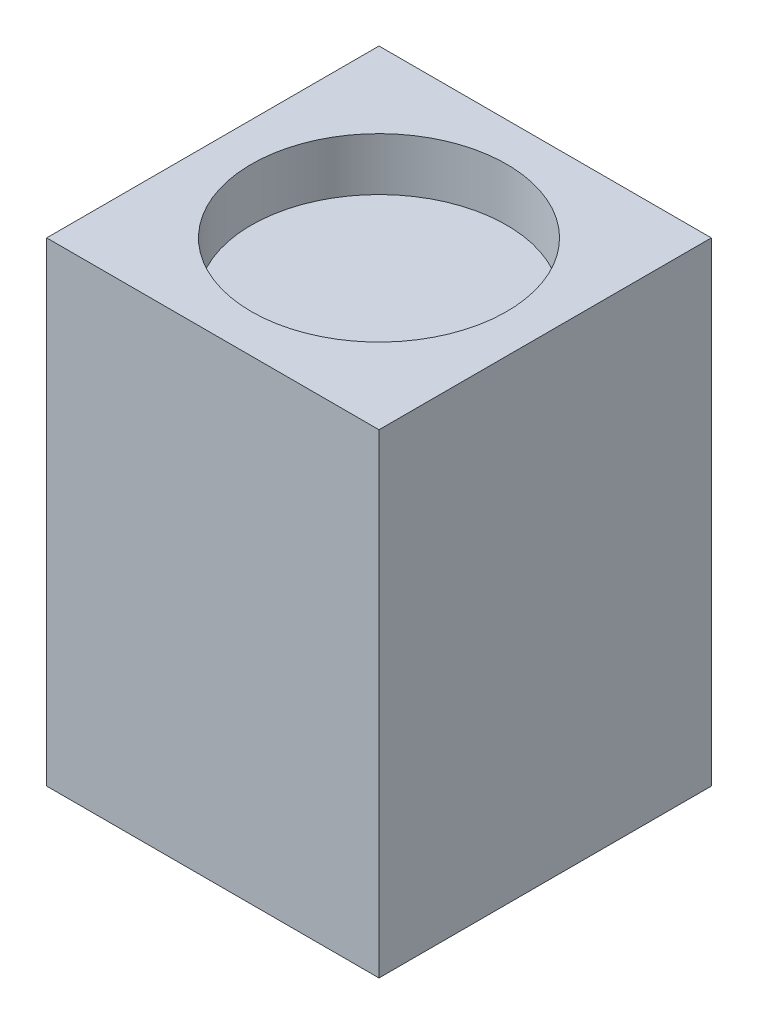
ISO-10303-21;
HEADER;
FILE_DESCRIPTION(('STEP AP214'),'2;1');
FILE_NAME('part.step','',(''),(''),'','','');
FILE_SCHEMA(('AUTOMOTIVE_DESIGN { 1 0 10303 214 1 1 1 1 }'));
ENDSEC;
DATA;
#1=APPLICATION_CONTEXT('core data for automotive mechanical design processes');
#2=APPLICATION_PROTOCOL_DEFINITION('international standard','automotive_design',2000,#1);
#3=PRODUCT_CONTEXT('',#1,'mechanical');
#4=PRODUCT('Part','Part','',(#3));
#5=PRODUCT_RELATED_PRODUCT_CATEGORY('part','',(#4));
#6=PRODUCT_DEFINITION_FORMATION('','',#4);
#7=PRODUCT_DEFINITION_CONTEXT('part definition',#1,'design');
#8=PRODUCT_DEFINITION('design','',#6,#7);
#9=PRODUCT_DEFINITION_SHAPE('','',#8);
#10=(LENGTH_UNIT() NAMED_UNIT(*) SI_UNIT(.MILLI.,.METRE.));
#11=(NAMED_UNIT(*) PLANE_ANGLE_UNIT() SI_UNIT($,.RADIAN.));
#12=(NAMED_UNIT(*) SI_UNIT($,.STERADIAN.) SOLID_ANGLE_UNIT());
#13=UNCERTAINTY_MEASURE_WITH_UNIT(LENGTH_MEASURE(1.E-05),#10,'distance_accuracy_value','');
#14=(GEOMETRIC_REPRESENTATION_CONTEXT(3) GLOBAL_UNCERTAINTY_ASSIGNED_CONTEXT((#13)) GLOBAL_UNIT_ASSIGNED_CONTEXT((#10,
#11,#12)) REPRESENTATION_CONTEXT('',''));
#15=CARTESIAN_POINT('',(0.,0.,0.));
#16=DIRECTION('',(0.,0.,1.));
#17=DIRECTION('',(1.,0.,0.));
#18=AXIS2_PLACEMENT_3D('',#15,#16,#17);
#19=CARTESIAN_POINT('',(-80.,228.6,0.));
#20=DIRECTION('',(1.,0.,0.));
#21=DIRECTION('',(0.,0.,-1.));
#22=AXIS2_PLACEMENT_3D('',#19,#20,#21);
#23=PLANE('',#22);
#24=DIRECTION('',(0.,0.,1.));
#25=VECTOR('',#24,1.);
#26=CARTESIAN_POINT('',(-80.,0.,0.));
#27=LINE('',#26,#25);
#28=CARTESIAN_POINT('',(-80.,0.,-80.));
#29=VERTEX_POINT('',#28);
#30=CARTESIAN_POINT('',(-80.,0.,80.));
#31=VERTEX_POINT('',#30);
#32=EDGE_CURVE('E81',#29,#31,#27,.T.);
#33=ORIENTED_EDGE('',*,*,#32,.T.);
#34=DIRECTION('',(0.,-1.,0.));
#35=VECTOR('',#34,1.);
#36=CARTESIAN_POINT('',(-80.,228.6,80.));
#37=LINE('',#36,#35);
#38=CARTESIAN_POINT('',(-80.,228.6,80.));
#39=VERTEX_POINT('',#38);
#40=EDGE_CURVE('E11',#39,#31,#37,.T.);
#41=ORIENTED_EDGE('',*,*,#40,.F.);
#42=DIRECTION('',(0.,0.,1.));
#43=VECTOR('',#42,1.);
#44=CARTESIAN_POINT('',(-80.,228.6,-80.));
#45=LINE('',#44,#43);
#46=CARTESIAN_POINT('',(-80.,228.6,-80.));
#47=VERTEX_POINT('',#46);
#48=EDGE_CURVE('E85',#47,#39,#45,.T.);
#49=ORIENTED_EDGE('',*,*,#48,.F.);
#50=DIRECTION('',(0.,-1.,0.));
#51=VECTOR('',#50,1.);
#52=CARTESIAN_POINT('',(-80.,228.6,-80.));
#53=LINE('',#52,#51);
#54=EDGE_CURVE('E109',#47,#29,#53,.T.);
#55=ORIENTED_EDGE('',*,*,#54,.T.);
#56=EDGE_LOOP('',(#33,#41,#49,#55));
#57=FACE_BOUND('',#56,.T.);
#58=ADVANCED_FACE('F44',(#57),#23,.F.);
#59=CARTESIAN_POINT('',(80.,228.6,80.));
#60=DIRECTION('',(0.,0.,1.));
#61=DIRECTION('',(1.,0.,0.));
#62=AXIS2_PLACEMENT_3D('',#59,#60,#61);
#63=PLANE('',#62);
#64=DIRECTION('',(-1.,0.,0.));
#65=VECTOR('',#64,1.);
#66=CARTESIAN_POINT('',(80.,0.,80.));
#67=LINE('',#66,#65);
#68=CARTESIAN_POINT('',(80.,0.,80.));
#69=VERTEX_POINT('',#68);
#70=EDGE_CURVE('E100',#69,#31,#67,.T.);
#71=ORIENTED_EDGE('',*,*,#70,.F.);
#72=DIRECTION('',(0.,-1.,0.));
#73=VECTOR('',#72,1.);
#74=CARTESIAN_POINT('',(80.,228.6,80.));
#75=LINE('',#74,#73);
#76=CARTESIAN_POINT('',(80.,228.6,80.));
#77=VERTEX_POINT('',#76);
#78=EDGE_CURVE('E53',#77,#69,#75,.T.);
#79=ORIENTED_EDGE('',*,*,#78,.F.);
#80=DIRECTION('',(1.,0.,0.));
#81=VECTOR('',#80,1.);
#82=CARTESIAN_POINT('',(-80.,228.6,80.));
#83=LINE('',#82,#81);
#84=EDGE_CURVE('E88',#39,#77,#83,.T.);
#85=ORIENTED_EDGE('',*,*,#84,.F.);
#86=ORIENTED_EDGE('',*,*,#40,.T.);
#87=EDGE_LOOP('',(#71,#79,#85,#86));
#88=FACE_BOUND('',#87,.T.);
#89=ADVANCED_FACE('F99',(#88),#63,.T.);
#90=CARTESIAN_POINT('',(80.,228.6,0.));
#91=DIRECTION('',(-1.,0.,0.));
#92=DIRECTION('',(0.,0.,1.));
#93=AXIS2_PLACEMENT_3D('',#90,#91,#92);
#94=PLANE('',#93);
#95=DIRECTION('',(0.,0.,-1.));
#96=VECTOR('',#95,1.);
#97=CARTESIAN_POINT('',(80.,0.,0.));
#98=LINE('',#97,#96);
#99=CARTESIAN_POINT('',(80.,0.,-80.));
#100=VERTEX_POINT('',#99);
#101=EDGE_CURVE('E118',#69,#100,#98,.T.);
#102=ORIENTED_EDGE('',*,*,#101,.T.);
#103=DIRECTION('',(0.,-1.,0.));
#104=VECTOR('',#103,1.);
#105=CARTESIAN_POINT('',(80.,228.6,-80.));
#106=LINE('',#105,#104);
#107=CARTESIAN_POINT('',(80.,228.6,-80.));
#108=VERTEX_POINT('',#107);
#109=EDGE_CURVE('E103',#108,#100,#106,.T.);
#110=ORIENTED_EDGE('',*,*,#109,.F.);
#111=DIRECTION('',(0.,0.,1.));
#112=VECTOR('',#111,1.);
#113=CARTESIAN_POINT('',(80.,228.6,0.));
#114=LINE('',#113,#112);
#115=EDGE_CURVE('E92',#108,#77,#114,.T.);
#116=ORIENTED_EDGE('',*,*,#115,.T.);
#117=ORIENTED_EDGE('',*,*,#78,.T.);
#118=EDGE_LOOP('',(#102,#110,#116,#117));
#119=FACE_BOUND('',#118,.T.);
#120=ADVANCED_FACE('F104',(#119),#94,.F.);
#121=CARTESIAN_POINT('',(0.,228.6,-80.));
#122=DIRECTION('',(0.,0.,1.));
#123=DIRECTION('',(1.,0.,0.));
#124=AXIS2_PLACEMENT_3D('',#121,#122,#123);
#125=PLANE('',#124);
#126=DIRECTION('',(-1.,0.,0.));
#127=VECTOR('',#126,1.);
#128=CARTESIAN_POINT('',(0.,0.,-80.));
#129=LINE('',#128,#127);
#130=EDGE_CURVE('E77',#100,#29,#129,.T.);
#131=ORIENTED_EDGE('',*,*,#130,.T.);
#132=ORIENTED_EDGE('',*,*,#54,.F.);
#133=DIRECTION('',(-1.,0.,0.));
#134=VECTOR('',#133,1.);
#135=CARTESIAN_POINT('',(80.,228.6,-80.));
#136=LINE('',#135,#134);
#137=EDGE_CURVE('E61',#108,#47,#136,.T.);
#138=ORIENTED_EDGE('',*,*,#137,.F.);
#139=ORIENTED_EDGE('',*,*,#109,.T.);
#140=EDGE_LOOP('',(#131,#132,#138,#139));
#141=FACE_BOUND('',#140,.T.);
#142=ADVANCED_FACE('F128',(#141),#125,.F.);
#143=CARTESIAN_POINT('',(0.,228.6,0.));
#144=DIRECTION('',(0.,1.,0.));
#145=DIRECTION('',(0.,0.,1.));
#146=AXIS2_PLACEMENT_3D('',#143,#144,#145);
#147=PLANE('',#146);
#148=CARTESIAN_POINT('',(0.,228.6,0.));
#149=DIRECTION('',(0.,1.,0.));
#150=DIRECTION('',(0.,0.,1.));
#151=AXIS2_PLACEMENT_3D('',#148,#149,#150);
#152=CIRCLE('',#151,61.468);
#153=CARTESIAN_POINT('',(0.,228.6,61.468));
#154=VERTEX_POINT('',#153);
#155=EDGE_CURVE('E132',#154,#154,#152,.T.);
#156=ORIENTED_EDGE('',*,*,#155,.F.);
#157=EDGE_LOOP('',(#156));
#158=FACE_BOUND('',#157,.T.);
#159=ORIENTED_EDGE('',*,*,#48,.T.);
#160=ORIENTED_EDGE('',*,*,#84,.T.);
#161=ORIENTED_EDGE('',*,*,#115,.F.);
#162=ORIENTED_EDGE('',*,*,#137,.T.);
#163=EDGE_LOOP('',(#159,#160,#161,#162));
#164=FACE_BOUND('',#163,.T.);
#165=ADVANCED_FACE('F90',(#158,#164),#147,.T.);
#166=CARTESIAN_POINT('',(0.,0.,0.));
#167=DIRECTION('',(0.,1.,0.));
#168=DIRECTION('',(0.,0.,1.));
#169=AXIS2_PLACEMENT_3D('',#166,#167,#168);
#170=PLANE('',#169);
#171=ORIENTED_EDGE('',*,*,#32,.F.);
#172=ORIENTED_EDGE('',*,*,#130,.F.);
#173=ORIENTED_EDGE('',*,*,#101,.F.);
#174=ORIENTED_EDGE('',*,*,#70,.T.);
#175=EDGE_LOOP('',(#171,#172,#173,#174));
#176=FACE_BOUND('',#175,.T.);
#177=ADVANCED_FACE('F145',(#176),#170,.F.);
#178=CARTESIAN_POINT('',(0.,203.2,0.));
#179=DIRECTION('',(0.,1.,0.));
#180=DIRECTION('',(0.,0.,1.));
#181=AXIS2_PLACEMENT_3D('',#178,#179,#180);
#182=CYLINDRICAL_SURFACE('',#181,61.468);
#183=CARTESIAN_POINT('',(0.,203.2,0.));
#184=DIRECTION('',(0.,1.,0.));
#185=DIRECTION('',(0.,0.,1.));
#186=AXIS2_PLACEMENT_3D('',#183,#184,#185);
#187=CIRCLE('',#186,61.468);
#188=CARTESIAN_POINT('',(0.,203.2,61.468));
#189=VERTEX_POINT('',#188);
#190=EDGE_CURVE('E115',#189,#189,#187,.T.);
#191=ORIENTED_EDGE('',*,*,#190,.F.);
#192=EDGE_LOOP('',(#191));
#193=FACE_BOUND('',#192,.T.);
#194=ORIENTED_EDGE('',*,*,#155,.T.);
#195=EDGE_LOOP('',(#194));
#196=FACE_BOUND('',#195,.T.);
#197=ADVANCED_FACE('F142',(#193,#196),#182,.F.);
#198=CARTESIAN_POINT('',(0.,203.2,0.));
#199=DIRECTION('',(0.,1.,0.));
#200=DIRECTION('',(0.,0.,1.));
#201=AXIS2_PLACEMENT_3D('',#198,#199,#200);
#202=PLANE('',#201);
#203=ORIENTED_EDGE('',*,*,#190,.T.);
#204=EDGE_LOOP('',(#203));
#205=FACE_BOUND('',#204,.T.);
#206=ADVANCED_FACE('F140',(#205),#202,.T.);
#207=CLOSED_SHELL('',(#58,#89,#120,#142,#165,#177,#197,#206));
#208=MANIFOLD_SOLID_BREP('B2',#207);
#209=ADVANCED_BREP_SHAPE_REPRESENTATION('',(#18,#208),#14);
#210=SHAPE_DEFINITION_REPRESENTATION(#9,#209);
ENDSEC;
END-ISO-10303-21;
